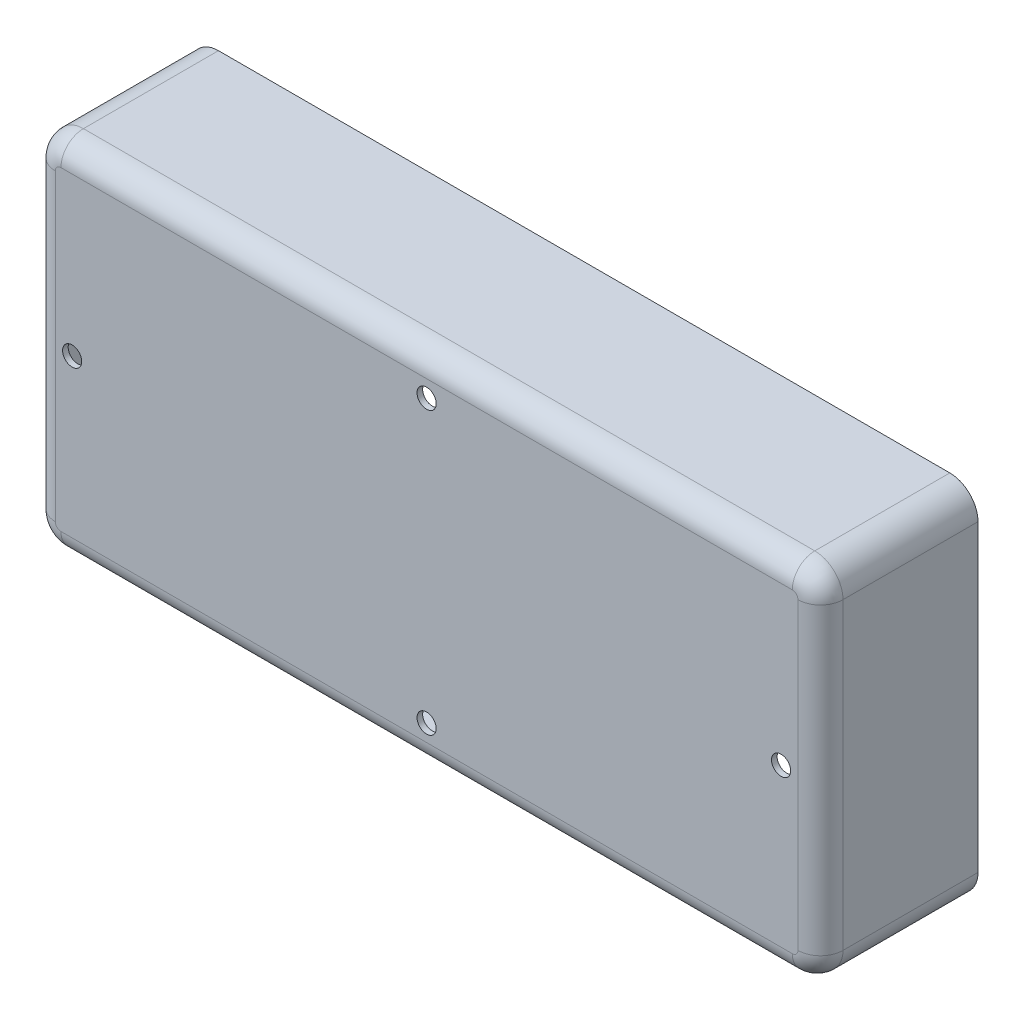
ISO-10303-21;
HEADER;
FILE_DESCRIPTION(('STEP AP214'),'2;1');
FILE_NAME('part.step','',(''),(''),'','','');
FILE_SCHEMA(('AUTOMOTIVE_DESIGN { 1 0 10303 214 1 1 1 1 }'));
ENDSEC;
DATA;
#1=APPLICATION_CONTEXT('core data for automotive mechanical design processes');
#2=APPLICATION_PROTOCOL_DEFINITION('international standard','automotive_design',2000,#1);
#3=PRODUCT_CONTEXT('',#1,'mechanical');
#4=PRODUCT('Part','Part','',(#3));
#5=PRODUCT_RELATED_PRODUCT_CATEGORY('part','',(#4));
#6=PRODUCT_DEFINITION_FORMATION('','',#4);
#7=PRODUCT_DEFINITION_CONTEXT('part definition',#1,'design');
#8=PRODUCT_DEFINITION('design','',#6,#7);
#9=PRODUCT_DEFINITION_SHAPE('','',#8);
#10=(LENGTH_UNIT() NAMED_UNIT(*) SI_UNIT(.MILLI.,.METRE.));
#11=(NAMED_UNIT(*) PLANE_ANGLE_UNIT() SI_UNIT($,.RADIAN.));
#12=(NAMED_UNIT(*) SI_UNIT($,.STERADIAN.) SOLID_ANGLE_UNIT());
#13=UNCERTAINTY_MEASURE_WITH_UNIT(LENGTH_MEASURE(1.E-05),#10,'distance_accuracy_value','');
#14=(GEOMETRIC_REPRESENTATION_CONTEXT(3) GLOBAL_UNCERTAINTY_ASSIGNED_CONTEXT((#13)) GLOBAL_UNIT_ASSIGNED_CONTEXT((#10,
#11,#12)) REPRESENTATION_CONTEXT('',''));
#15=CARTESIAN_POINT('',(0.,0.,0.));
#16=DIRECTION('',(0.,0.,1.));
#17=DIRECTION('',(1.,0.,0.));
#18=AXIS2_PLACEMENT_3D('',#15,#16,#17);
#19=CARTESIAN_POINT('',(-103.1748,-42.8498,44.45));
#20=DIRECTION('',(0.,0.,-1.));
#21=DIRECTION('',(-1.,0.,0.));
#22=AXIS2_PLACEMENT_3D('',#19,#20,#21);
#23=CYLINDRICAL_SURFACE('',#22,7.95019999999999);
#24=DIRECTION('',(0.,0.,-1.));
#25=VECTOR('',#24,1.);
#26=CARTESIAN_POINT('',(-103.1748,-50.8,44.45));
#27=LINE('',#26,#25);
#28=CARTESIAN_POINT('',(-103.1748,-50.8,38.1));
#29=VERTEX_POINT('',#28);
#30=CARTESIAN_POINT('',(-103.1748,-50.8,0.));
#31=VERTEX_POINT('',#30);
#32=EDGE_CURVE('E305',#29,#31,#27,.T.);
#33=ORIENTED_EDGE('',*,*,#32,.F.);
#34=CARTESIAN_POINT('',(-103.1748,-42.8498,38.1));
#35=DIRECTION('',(0.,0.,1.));
#36=DIRECTION('',(1.,0.,0.));
#37=AXIS2_PLACEMENT_3D('',#34,#35,#36);
#38=CIRCLE('',#37,7.95019999999999);
#39=CARTESIAN_POINT('',(-111.125,-42.8498,38.1));
#40=VERTEX_POINT('',#39);
#41=EDGE_CURVE('E12',#29,#40,#38,.F.);
#42=ORIENTED_EDGE('',*,*,#41,.T.);
#43=DIRECTION('',(0.,0.,-1.));
#44=VECTOR('',#43,1.);
#45=CARTESIAN_POINT('',(-111.125,-42.8498,44.45));
#46=LINE('',#45,#44);
#47=CARTESIAN_POINT('',(-111.125,-42.8498,0.));
#48=VERTEX_POINT('',#47);
#49=EDGE_CURVE('E291',#40,#48,#46,.T.);
#50=ORIENTED_EDGE('',*,*,#49,.T.);
#51=CARTESIAN_POINT('',(-103.1748,-42.8498,0.));
#52=DIRECTION('',(0.,0.,1.));
#53=DIRECTION('',(1.,0.,0.));
#54=AXIS2_PLACEMENT_3D('',#51,#52,#53);
#55=CIRCLE('',#54,7.95019999999999);
#56=EDGE_CURVE('E267',#48,#31,#55,.T.);
#57=ORIENTED_EDGE('',*,*,#56,.T.);
#58=EDGE_LOOP('',(#33,#42,#50,#57));
#59=FACE_BOUND('',#58,.T.);
#60=ADVANCED_FACE('F39',(#59),#23,.T.);
#61=CARTESIAN_POINT('',(-103.1748,-50.8,44.45));
#62=DIRECTION('',(0.,1.,0.));
#63=DIRECTION('',(0.,0.,1.));
#64=AXIS2_PLACEMENT_3D('',#61,#62,#63);
#65=PLANE('',#64);
#66=DIRECTION('',(0.,0.,-1.));
#67=VECTOR('',#66,1.);
#68=CARTESIAN_POINT('',(103.1748,-50.8,44.45));
#69=LINE('',#68,#67);
#70=CARTESIAN_POINT('',(103.1748,-50.8,38.1));
#71=VERTEX_POINT('',#70);
#72=CARTESIAN_POINT('',(103.1748,-50.8,0.));
#73=VERTEX_POINT('',#72);
#74=EDGE_CURVE('E303',#71,#73,#69,.T.);
#75=ORIENTED_EDGE('',*,*,#74,.F.);
#76=DIRECTION('',(1.,0.,0.));
#77=VECTOR('',#76,1.);
#78=CARTESIAN_POINT('',(-103.1748,-50.8,38.1));
#79=LINE('',#78,#77);
#80=EDGE_CURVE('E48',#71,#29,#79,.F.);
#81=ORIENTED_EDGE('',*,*,#80,.T.);
#82=ORIENTED_EDGE('',*,*,#32,.T.);
#83=DIRECTION('',(1.,0.,0.));
#84=VECTOR('',#83,1.);
#85=CARTESIAN_POINT('',(-103.1748,-50.8,0.));
#86=LINE('',#85,#84);
#87=EDGE_CURVE('E270',#31,#73,#86,.T.);
#88=ORIENTED_EDGE('',*,*,#87,.T.);
#89=EDGE_LOOP('',(#75,#81,#82,#88));
#90=FACE_BOUND('',#89,.T.);
#91=ADVANCED_FACE('F433',(#90),#65,.F.);
#92=CARTESIAN_POINT('',(103.1748,-42.8498,44.45));
#93=DIRECTION('',(0.,0.,-1.));
#94=DIRECTION('',(-1.,0.,0.));
#95=AXIS2_PLACEMENT_3D('',#92,#93,#94);
#96=CYLINDRICAL_SURFACE('',#95,7.95019999999999);
#97=DIRECTION('',(0.,0.,-1.));
#98=VECTOR('',#97,1.);
#99=CARTESIAN_POINT('',(111.125,-42.8498,44.45));
#100=LINE('',#99,#98);
#101=CARTESIAN_POINT('',(111.125,-42.8498,38.1));
#102=VERTEX_POINT('',#101);
#103=CARTESIAN_POINT('',(111.125,-42.8498,0.));
#104=VERTEX_POINT('',#103);
#105=EDGE_CURVE('E301',#102,#104,#100,.T.);
#106=ORIENTED_EDGE('',*,*,#105,.F.);
#107=CARTESIAN_POINT('',(103.1748,-42.8498,38.1));
#108=DIRECTION('',(0.,0.,1.));
#109=DIRECTION('',(1.,0.,0.));
#110=AXIS2_PLACEMENT_3D('',#107,#108,#109);
#111=CIRCLE('',#110,7.95019999999999);
#112=EDGE_CURVE('E335',#102,#71,#111,.F.);
#113=ORIENTED_EDGE('',*,*,#112,.T.);
#114=ORIENTED_EDGE('',*,*,#74,.T.);
#115=CARTESIAN_POINT('',(103.1748,-42.8498,0.));
#116=DIRECTION('',(0.,0.,1.));
#117=DIRECTION('',(1.,0.,0.));
#118=AXIS2_PLACEMENT_3D('',#115,#116,#117);
#119=CIRCLE('',#118,7.95019999999999);
#120=EDGE_CURVE('E273',#73,#104,#119,.T.);
#121=ORIENTED_EDGE('',*,*,#120,.T.);
#122=EDGE_LOOP('',(#106,#113,#114,#121));
#123=FACE_BOUND('',#122,.T.);
#124=ADVANCED_FACE('F373',(#123),#96,.T.);
#125=CARTESIAN_POINT('',(111.125,42.8498,44.45));
#126=DIRECTION('',(-1.,0.,0.));
#127=DIRECTION('',(0.,0.,1.));
#128=AXIS2_PLACEMENT_3D('',#125,#126,#127);
#129=PLANE('',#128);
#130=DIRECTION('',(0.,0.,-1.));
#131=VECTOR('',#130,1.);
#132=CARTESIAN_POINT('',(111.125,42.8498,44.45));
#133=LINE('',#132,#131);
#134=CARTESIAN_POINT('',(111.125,42.8498,38.1));
#135=VERTEX_POINT('',#134);
#136=CARTESIAN_POINT('',(111.125,42.8498,0.));
#137=VERTEX_POINT('',#136);
#138=EDGE_CURVE('E299',#135,#137,#133,.T.);
#139=ORIENTED_EDGE('',*,*,#138,.F.);
#140=DIRECTION('',(0.,1.,0.));
#141=VECTOR('',#140,1.);
#142=CARTESIAN_POINT('',(111.125,-42.8498,38.1));
#143=LINE('',#142,#141);
#144=EDGE_CURVE('E333',#135,#102,#143,.F.);
#145=ORIENTED_EDGE('',*,*,#144,.T.);
#146=ORIENTED_EDGE('',*,*,#105,.T.);
#147=DIRECTION('',(0.,1.,0.));
#148=VECTOR('',#147,1.);
#149=CARTESIAN_POINT('',(111.125,42.8498,0.));
#150=LINE('',#149,#148);
#151=EDGE_CURVE('E276',#104,#137,#150,.T.);
#152=ORIENTED_EDGE('',*,*,#151,.T.);
#153=EDGE_LOOP('',(#139,#145,#146,#152));
#154=FACE_BOUND('',#153,.T.);
#155=ADVANCED_FACE('F371',(#154),#129,.F.);
#156=CARTESIAN_POINT('',(103.1748,42.8498,44.45));
#157=DIRECTION('',(0.,0.,-1.));
#158=DIRECTION('',(-1.,0.,0.));
#159=AXIS2_PLACEMENT_3D('',#156,#157,#158);
#160=CYLINDRICAL_SURFACE('',#159,7.95019999999999);
#161=DIRECTION('',(0.,0.,-1.));
#162=VECTOR('',#161,1.);
#163=CARTESIAN_POINT('',(103.1748,50.8,44.45));
#164=LINE('',#163,#162);
#165=CARTESIAN_POINT('',(103.1748,50.8,38.1));
#166=VERTEX_POINT('',#165);
#167=CARTESIAN_POINT('',(103.1748,50.8,0.));
#168=VERTEX_POINT('',#167);
#169=EDGE_CURVE('E297',#166,#168,#164,.T.);
#170=ORIENTED_EDGE('',*,*,#169,.F.);
#171=CARTESIAN_POINT('',(103.1748,42.8498,38.1));
#172=DIRECTION('',(0.,0.,1.));
#173=DIRECTION('',(1.,0.,0.));
#174=AXIS2_PLACEMENT_3D('',#171,#172,#173);
#175=CIRCLE('',#174,7.95019999999999);
#176=EDGE_CURVE('E331',#166,#135,#175,.F.);
#177=ORIENTED_EDGE('',*,*,#176,.T.);
#178=ORIENTED_EDGE('',*,*,#138,.T.);
#179=CARTESIAN_POINT('',(103.1748,42.8498,0.));
#180=DIRECTION('',(0.,0.,1.));
#181=DIRECTION('',(-1.,0.,0.));
#182=AXIS2_PLACEMENT_3D('',#179,#180,#181);
#183=CIRCLE('',#182,7.95019999999999);
#184=EDGE_CURVE('E279',#137,#168,#183,.T.);
#185=ORIENTED_EDGE('',*,*,#184,.T.);
#186=EDGE_LOOP('',(#170,#177,#178,#185));
#187=FACE_BOUND('',#186,.T.);
#188=ADVANCED_FACE('F385',(#187),#160,.T.);
#189=CARTESIAN_POINT('',(-103.1748,50.8,44.45));
#190=DIRECTION('',(0.,-1.,0.));
#191=DIRECTION('',(0.,0.,-1.));
#192=AXIS2_PLACEMENT_3D('',#189,#190,#191);
#193=PLANE('',#192);
#194=DIRECTION('',(0.,0.,-1.));
#195=VECTOR('',#194,1.);
#196=CARTESIAN_POINT('',(-103.1748,50.8,44.45));
#197=LINE('',#196,#195);
#198=CARTESIAN_POINT('',(-103.1748,50.8,38.1));
#199=VERTEX_POINT('',#198);
#200=CARTESIAN_POINT('',(-103.1748,50.8,0.));
#201=VERTEX_POINT('',#200);
#202=EDGE_CURVE('E295',#199,#201,#197,.T.);
#203=ORIENTED_EDGE('',*,*,#202,.F.);
#204=DIRECTION('',(-1.,0.,0.));
#205=VECTOR('',#204,1.);
#206=CARTESIAN_POINT('',(103.1748,50.8,38.1));
#207=LINE('',#206,#205);
#208=EDGE_CURVE('E329',#199,#166,#207,.F.);
#209=ORIENTED_EDGE('',*,*,#208,.T.);
#210=ORIENTED_EDGE('',*,*,#169,.T.);
#211=DIRECTION('',(-1.,0.,0.));
#212=VECTOR('',#211,1.);
#213=CARTESIAN_POINT('',(-103.1748,50.8,0.));
#214=LINE('',#213,#212);
#215=EDGE_CURVE('E282',#168,#201,#214,.T.);
#216=ORIENTED_EDGE('',*,*,#215,.T.);
#217=EDGE_LOOP('',(#203,#209,#210,#216));
#218=FACE_BOUND('',#217,.T.);
#219=ADVANCED_FACE('F388',(#218),#193,.F.);
#220=CARTESIAN_POINT('',(-103.1748,42.8498,44.45));
#221=DIRECTION('',(0.,0.,-1.));
#222=DIRECTION('',(-1.,0.,0.));
#223=AXIS2_PLACEMENT_3D('',#220,#221,#222);
#224=CYLINDRICAL_SURFACE('',#223,7.95019999999999);
#225=DIRECTION('',(0.,0.,-1.));
#226=VECTOR('',#225,1.);
#227=CARTESIAN_POINT('',(-111.125,42.8498,44.45));
#228=LINE('',#227,#226);
#229=CARTESIAN_POINT('',(-111.125,42.8498,38.1));
#230=VERTEX_POINT('',#229);
#231=CARTESIAN_POINT('',(-111.125,42.8498,0.));
#232=VERTEX_POINT('',#231);
#233=EDGE_CURVE('E293',#230,#232,#228,.T.);
#234=ORIENTED_EDGE('',*,*,#233,.F.);
#235=CARTESIAN_POINT('',(-103.1748,42.8498,38.1));
#236=DIRECTION('',(0.,0.,1.));
#237=DIRECTION('',(1.,0.,0.));
#238=AXIS2_PLACEMENT_3D('',#235,#236,#237);
#239=CIRCLE('',#238,7.95019999999999);
#240=EDGE_CURVE('E327',#230,#199,#239,.F.);
#241=ORIENTED_EDGE('',*,*,#240,.T.);
#242=ORIENTED_EDGE('',*,*,#202,.T.);
#243=CARTESIAN_POINT('',(-103.1748,42.8498,0.));
#244=DIRECTION('',(0.,0.,1.));
#245=DIRECTION('',(1.,0.,0.));
#246=AXIS2_PLACEMENT_3D('',#243,#244,#245);
#247=CIRCLE('',#246,7.95019999999999);
#248=EDGE_CURVE('E285',#201,#232,#247,.T.);
#249=ORIENTED_EDGE('',*,*,#248,.T.);
#250=EDGE_LOOP('',(#234,#241,#242,#249));
#251=FACE_BOUND('',#250,.T.);
#252=ADVANCED_FACE('F447',(#251),#224,.T.);
#253=CARTESIAN_POINT('',(-111.125,42.8498,44.45));
#254=DIRECTION('',(1.,0.,0.));
#255=DIRECTION('',(0.,0.,-1.));
#256=AXIS2_PLACEMENT_3D('',#253,#254,#255);
#257=PLANE('',#256);
#258=ORIENTED_EDGE('',*,*,#49,.F.);
#259=DIRECTION('',(0.,-1.,0.));
#260=VECTOR('',#259,1.);
#261=CARTESIAN_POINT('',(-111.125,42.8498,38.1));
#262=LINE('',#261,#260);
#263=EDGE_CURVE('E324',#40,#230,#262,.F.);
#264=ORIENTED_EDGE('',*,*,#263,.T.);
#265=ORIENTED_EDGE('',*,*,#233,.T.);
#266=DIRECTION('',(0.,-1.,0.));
#267=VECTOR('',#266,1.);
#268=CARTESIAN_POINT('',(-111.125,42.8498,0.));
#269=LINE('',#268,#267);
#270=EDGE_CURVE('E288',#232,#48,#269,.T.);
#271=ORIENTED_EDGE('',*,*,#270,.T.);
#272=EDGE_LOOP('',(#258,#264,#265,#271));
#273=FACE_BOUND('',#272,.T.);
#274=ADVANCED_FACE('F417',(#273),#257,.F.);
#275=CARTESIAN_POINT('',(-103.1748,-42.8498,44.45));
#276=DIRECTION('',(0.,0.,1.));
#277=DIRECTION('',(1.,0.,0.));
#278=AXIS2_PLACEMENT_3D('',#275,#276,#277);
#279=PLANE('',#278);
#280=CARTESIAN_POINT('',(-100.0125,0.,44.45));
#281=DIRECTION('',(0.,0.,1.));
#282=DIRECTION('',(1.,0.,0.));
#283=AXIS2_PLACEMENT_3D('',#280,#281,#282);
#284=CIRCLE('',#283,2.7051);
#285=CARTESIAN_POINT('',(-97.3074,0.,44.45));
#286=VERTEX_POINT('',#285);
#287=EDGE_CURVE('E535',#286,#286,#284,.T.);
#288=ORIENTED_EDGE('',*,*,#287,.F.);
#289=EDGE_LOOP('',(#288));
#290=FACE_BOUND('',#289,.T.);
#291=CARTESIAN_POINT('',(100.0125,0.,44.45));
#292=DIRECTION('',(0.,0.,1.));
#293=DIRECTION('',(1.,0.,0.));
#294=AXIS2_PLACEMENT_3D('',#291,#292,#293);
#295=CIRCLE('',#294,2.7051);
#296=CARTESIAN_POINT('',(102.7176,0.,44.45));
#297=VERTEX_POINT('',#296);
#298=EDGE_CURVE('E539',#297,#297,#295,.T.);
#299=ORIENTED_EDGE('',*,*,#298,.F.);
#300=EDGE_LOOP('',(#299));
#301=FACE_BOUND('',#300,.T.);
#302=CARTESIAN_POINT('',(0.,-39.6875,44.45));
#303=DIRECTION('',(0.,0.,1.));
#304=DIRECTION('',(1.,0.,0.));
#305=AXIS2_PLACEMENT_3D('',#302,#303,#304);
#306=CIRCLE('',#305,2.7051);
#307=CARTESIAN_POINT('',(2.7051,-39.6875,44.45));
#308=VERTEX_POINT('',#307);
#309=EDGE_CURVE('E551',#308,#308,#306,.T.);
#310=ORIENTED_EDGE('',*,*,#309,.F.);
#311=EDGE_LOOP('',(#310));
#312=FACE_BOUND('',#311,.T.);
#313=CARTESIAN_POINT('',(0.,39.6875,44.45));
#314=DIRECTION('',(0.,0.,1.));
#315=DIRECTION('',(1.,0.,0.));
#316=AXIS2_PLACEMENT_3D('',#313,#314,#315);
#317=CIRCLE('',#316,2.7051);
#318=CARTESIAN_POINT('',(2.7051,39.6875,44.45));
#319=VERTEX_POINT('',#318);
#320=EDGE_CURVE('E243',#319,#319,#317,.T.);
#321=ORIENTED_EDGE('',*,*,#320,.F.);
#322=EDGE_LOOP('',(#321));
#323=FACE_BOUND('',#322,.T.);
#324=CARTESIAN_POINT('',(-103.1748,42.8498,44.45));
#325=DIRECTION('',(0.,0.,1.));
#326=DIRECTION('',(1.,0.,0.));
#327=AXIS2_PLACEMENT_3D('',#324,#325,#326);
#328=CIRCLE('',#327,1.60019999999999);
#329=CARTESIAN_POINT('',(-103.1748,44.45,44.45));
#330=VERTEX_POINT('',#329);
#331=CARTESIAN_POINT('',(-104.775,42.8498,44.45));
#332=VERTEX_POINT('',#331);
#333=EDGE_CURVE('E319',#330,#332,#328,.T.);
#334=ORIENTED_EDGE('',*,*,#333,.T.);
#335=DIRECTION('',(0.,-1.,0.));
#336=VECTOR('',#335,1.);
#337=CARTESIAN_POINT('',(-104.775,-42.8498,44.45));
#338=LINE('',#337,#336);
#339=CARTESIAN_POINT('',(-104.775,-42.8498,44.45));
#340=VERTEX_POINT('',#339);
#341=EDGE_CURVE('E321',#332,#340,#338,.T.);
#342=ORIENTED_EDGE('',*,*,#341,.T.);
#343=CARTESIAN_POINT('',(-103.1748,-42.8498,44.45));
#344=DIRECTION('',(0.,0.,1.));
#345=DIRECTION('',(1.,0.,0.));
#346=AXIS2_PLACEMENT_3D('',#343,#344,#345);
#347=CIRCLE('',#346,1.60019999999999);
#348=CARTESIAN_POINT('',(-103.1748,-44.45,44.45));
#349=VERTEX_POINT('',#348);
#350=EDGE_CURVE('E307',#340,#349,#347,.T.);
#351=ORIENTED_EDGE('',*,*,#350,.T.);
#352=DIRECTION('',(1.,0.,0.));
#353=VECTOR('',#352,1.);
#354=CARTESIAN_POINT('',(103.1748,-44.45,44.45));
#355=LINE('',#354,#353);
#356=CARTESIAN_POINT('',(103.1748,-44.45,44.45));
#357=VERTEX_POINT('',#356);
#358=EDGE_CURVE('E309',#349,#357,#355,.T.);
#359=ORIENTED_EDGE('',*,*,#358,.T.);
#360=CARTESIAN_POINT('',(103.1748,-42.8498,44.45));
#361=DIRECTION('',(0.,0.,1.));
#362=DIRECTION('',(1.,0.,0.));
#363=AXIS2_PLACEMENT_3D('',#360,#361,#362);
#364=CIRCLE('',#363,1.60019999999999);
#365=CARTESIAN_POINT('',(104.775,-42.8498,44.45));
#366=VERTEX_POINT('',#365);
#367=EDGE_CURVE('E311',#357,#366,#364,.T.);
#368=ORIENTED_EDGE('',*,*,#367,.T.);
#369=DIRECTION('',(0.,1.,0.));
#370=VECTOR('',#369,1.);
#371=CARTESIAN_POINT('',(104.775,42.8498,44.45));
#372=LINE('',#371,#370);
#373=CARTESIAN_POINT('',(104.775,42.8498,44.45));
#374=VERTEX_POINT('',#373);
#375=EDGE_CURVE('E313',#366,#374,#372,.T.);
#376=ORIENTED_EDGE('',*,*,#375,.T.);
#377=CARTESIAN_POINT('',(103.1748,42.8498,44.45));
#378=DIRECTION('',(0.,0.,1.));
#379=DIRECTION('',(1.,0.,0.));
#380=AXIS2_PLACEMENT_3D('',#377,#378,#379);
#381=CIRCLE('',#380,1.60019999999999);
#382=CARTESIAN_POINT('',(103.1748,44.45,44.45));
#383=VERTEX_POINT('',#382);
#384=EDGE_CURVE('E315',#374,#383,#381,.T.);
#385=ORIENTED_EDGE('',*,*,#384,.T.);
#386=DIRECTION('',(-1.,0.,0.));
#387=VECTOR('',#386,1.);
#388=CARTESIAN_POINT('',(-103.1748,44.45,44.45));
#389=LINE('',#388,#387);
#390=EDGE_CURVE('E317',#383,#330,#389,.T.);
#391=ORIENTED_EDGE('',*,*,#390,.T.);
#392=EDGE_LOOP('',(#334,#342,#351,#359,#368,#376,#385,#391));
#393=FACE_BOUND('',#392,.T.);
#394=ADVANCED_FACE('F401',(#290,#301,#312,#323,#393),#279,.T.);
#395=CARTESIAN_POINT('',(-103.1748,-42.8498,0.));
#396=DIRECTION('',(0.,0.,1.));
#397=DIRECTION('',(1.,0.,0.));
#398=AXIS2_PLACEMENT_3D('',#395,#396,#397);
#399=PLANE('',#398);
#400=DIRECTION('',(0.,-1.,0.));
#401=VECTOR('',#400,1.);
#402=CARTESIAN_POINT('',(-109.5375,42.8498,0.));
#403=LINE('',#402,#401);
#404=CARTESIAN_POINT('',(-109.5375,42.8498,0.));
#405=VERTEX_POINT('',#404);
#406=CARTESIAN_POINT('',(-109.5375,-42.8498,0.));
#407=VERTEX_POINT('',#406);
#408=EDGE_CURVE('E224',#405,#407,#403,.T.);
#409=ORIENTED_EDGE('',*,*,#408,.T.);
#410=CARTESIAN_POINT('',(-103.1748,-42.8498,0.));
#411=DIRECTION('',(0.,0.,1.));
#412=DIRECTION('',(1.,0.,0.));
#413=AXIS2_PLACEMENT_3D('',#410,#411,#412);
#414=CIRCLE('',#413,6.36269999999999);
#415=CARTESIAN_POINT('',(-103.1748,-49.2125,0.));
#416=VERTEX_POINT('',#415);
#417=EDGE_CURVE('E219',#407,#416,#414,.T.);
#418=ORIENTED_EDGE('',*,*,#417,.T.);
#419=DIRECTION('',(1.,0.,0.));
#420=VECTOR('',#419,1.);
#421=CARTESIAN_POINT('',(-103.1748,-49.2125,0.));
#422=LINE('',#421,#420);
#423=CARTESIAN_POINT('',(103.1748,-49.2125,0.));
#424=VERTEX_POINT('',#423);
#425=EDGE_CURVE('E249',#416,#424,#422,.T.);
#426=ORIENTED_EDGE('',*,*,#425,.T.);
#427=CARTESIAN_POINT('',(103.1748,-42.8498,0.));
#428=DIRECTION('',(0.,0.,1.));
#429=DIRECTION('',(1.,0.,0.));
#430=AXIS2_PLACEMENT_3D('',#427,#428,#429);
#431=CIRCLE('',#430,6.36269999999999);
#432=CARTESIAN_POINT('',(109.5375,-42.8498,0.));
#433=VERTEX_POINT('',#432);
#434=EDGE_CURVE('E56',#424,#433,#431,.T.);
#435=ORIENTED_EDGE('',*,*,#434,.T.);
#436=DIRECTION('',(0.,1.,0.));
#437=VECTOR('',#436,1.);
#438=CARTESIAN_POINT('',(109.5375,42.8498,0.));
#439=LINE('',#438,#437);
#440=CARTESIAN_POINT('',(109.5375,42.8498,0.));
#441=VERTEX_POINT('',#440);
#442=EDGE_CURVE('E261',#433,#441,#439,.T.);
#443=ORIENTED_EDGE('',*,*,#442,.T.);
#444=CARTESIAN_POINT('',(103.1748,42.8498,0.));
#445=DIRECTION('',(0.,0.,1.));
#446=DIRECTION('',(1.,0.,0.));
#447=AXIS2_PLACEMENT_3D('',#444,#445,#446);
#448=CIRCLE('',#447,6.36269999999999);
#449=CARTESIAN_POINT('',(103.1748,49.2125,0.));
#450=VERTEX_POINT('',#449);
#451=EDGE_CURVE('E258',#441,#450,#448,.T.);
#452=ORIENTED_EDGE('',*,*,#451,.T.);
#453=DIRECTION('',(-1.,0.,0.));
#454=VECTOR('',#453,1.);
#455=CARTESIAN_POINT('',(-103.1748,49.2125,0.));
#456=LINE('',#455,#454);
#457=CARTESIAN_POINT('',(-103.1748,49.2125,0.));
#458=VERTEX_POINT('',#457);
#459=EDGE_CURVE('E255',#450,#458,#456,.T.);
#460=ORIENTED_EDGE('',*,*,#459,.T.);
#461=CARTESIAN_POINT('',(-103.1748,42.8498,0.));
#462=DIRECTION('',(0.,0.,1.));
#463=DIRECTION('',(1.,0.,0.));
#464=AXIS2_PLACEMENT_3D('',#461,#462,#463);
#465=CIRCLE('',#464,6.36269999999999);
#466=EDGE_CURVE('E252',#458,#405,#465,.T.);
#467=ORIENTED_EDGE('',*,*,#466,.T.);
#468=EDGE_LOOP('',(#409,#418,#426,#435,#443,#452,#460,#467));
#469=FACE_BOUND('',#468,.T.);
#470=ORIENTED_EDGE('',*,*,#56,.F.);
#471=ORIENTED_EDGE('',*,*,#270,.F.);
#472=ORIENTED_EDGE('',*,*,#248,.F.);
#473=ORIENTED_EDGE('',*,*,#215,.F.);
#474=ORIENTED_EDGE('',*,*,#184,.F.);
#475=ORIENTED_EDGE('',*,*,#151,.F.);
#476=ORIENTED_EDGE('',*,*,#120,.F.);
#477=ORIENTED_EDGE('',*,*,#87,.F.);
#478=EDGE_LOOP('',(#470,#471,#472,#473,#474,#475,#476,#477));
#479=FACE_BOUND('',#478,.T.);
#480=ADVANCED_FACE('F380',(#469,#479),#399,.F.);
#481=CARTESIAN_POINT('',(104.775,-42.8498,38.1));
#482=DIRECTION('',(0.,-1.,0.));
#483=DIRECTION('',(0.,0.,-1.));
#484=AXIS2_PLACEMENT_3D('',#481,#482,#483);
#485=CYLINDRICAL_SURFACE('',#484,6.35);
#486=CARTESIAN_POINT('',(104.775,-42.8498,38.1));
#487=DIRECTION('',(0.,-1.,0.));
#488=DIRECTION('',(0.,0.,-1.));
#489=AXIS2_PLACEMENT_3D('',#486,#487,#488);
#490=CIRCLE('',#489,6.35);
#491=EDGE_CURVE('E352',#102,#366,#490,.T.);
#492=ORIENTED_EDGE('',*,*,#491,.F.);
#493=ORIENTED_EDGE('',*,*,#144,.F.);
#494=CARTESIAN_POINT('',(104.775,42.8498,38.1));
#495=DIRECTION('',(0.,1.,0.));
#496=DIRECTION('',(0.,0.,1.));
#497=AXIS2_PLACEMENT_3D('',#494,#495,#496);
#498=CIRCLE('',#497,6.35);
#499=EDGE_CURVE('E43',#374,#135,#498,.T.);
#500=ORIENTED_EDGE('',*,*,#499,.F.);
#501=ORIENTED_EDGE('',*,*,#375,.F.);
#502=EDGE_LOOP('',(#492,#493,#500,#501));
#503=FACE_BOUND('',#502,.T.);
#504=ADVANCED_FACE('F41',(#503),#485,.T.);
#505=CARTESIAN_POINT('',(103.1748,42.8498,38.1));
#506=DIRECTION('',(0.,0.,1.));
#507=DIRECTION('',(1.,0.,0.));
#508=AXIS2_PLACEMENT_3D('',#505,#506,#507);
#509=DEGENERATE_TOROIDAL_SURFACE('',#508,1.60019999999999,6.35,.T.);
#510=ORIENTED_EDGE('',*,*,#499,.T.);
#511=ORIENTED_EDGE('',*,*,#176,.F.);
#512=CARTESIAN_POINT('',(103.1748,44.45,38.1));
#513=DIRECTION('',(-1.,0.,0.));
#514=DIRECTION('',(0.,0.,1.));
#515=AXIS2_PLACEMENT_3D('',#512,#513,#514);
#516=CIRCLE('',#515,6.35);
#517=EDGE_CURVE('E350',#383,#166,#516,.T.);
#518=ORIENTED_EDGE('',*,*,#517,.F.);
#519=ORIENTED_EDGE('',*,*,#384,.F.);
#520=EDGE_LOOP('',(#510,#511,#518,#519));
#521=FACE_BOUND('',#520,.T.);
#522=ADVANCED_FACE('F363',(#521),#509,.T.);
#523=CARTESIAN_POINT('',(103.1748,-42.8498,38.1));
#524=DIRECTION('',(0.,0.,1.));
#525=DIRECTION('',(1.,0.,0.));
#526=AXIS2_PLACEMENT_3D('',#523,#524,#525);
#527=DEGENERATE_TOROIDAL_SURFACE('',#526,1.60019999999999,6.35,.T.);
#528=ORIENTED_EDGE('',*,*,#491,.T.);
#529=ORIENTED_EDGE('',*,*,#367,.F.);
#530=CARTESIAN_POINT('',(103.1748,-44.45,38.1));
#531=DIRECTION('',(-1.,0.,0.));
#532=DIRECTION('',(0.,0.,1.));
#533=AXIS2_PLACEMENT_3D('',#530,#531,#532);
#534=CIRCLE('',#533,6.35);
#535=EDGE_CURVE('E347',#71,#357,#534,.T.);
#536=ORIENTED_EDGE('',*,*,#535,.F.);
#537=ORIENTED_EDGE('',*,*,#112,.F.);
#538=EDGE_LOOP('',(#528,#529,#536,#537));
#539=FACE_BOUND('',#538,.T.);
#540=ADVANCED_FACE('F404',(#539),#527,.T.);
#541=CARTESIAN_POINT('',(-103.1748,44.45,38.1));
#542=DIRECTION('',(1.,0.,0.));
#543=DIRECTION('',(0.,0.,-1.));
#544=AXIS2_PLACEMENT_3D('',#541,#542,#543);
#545=CYLINDRICAL_SURFACE('',#544,6.35);
#546=ORIENTED_EDGE('',*,*,#517,.T.);
#547=ORIENTED_EDGE('',*,*,#208,.F.);
#548=CARTESIAN_POINT('',(-103.1748,44.45,38.1));
#549=DIRECTION('',(-1.,0.,0.));
#550=DIRECTION('',(0.,0.,1.));
#551=AXIS2_PLACEMENT_3D('',#548,#549,#550);
#552=CIRCLE('',#551,6.35);
#553=EDGE_CURVE('E344',#330,#199,#552,.T.);
#554=ORIENTED_EDGE('',*,*,#553,.F.);
#555=ORIENTED_EDGE('',*,*,#390,.F.);
#556=EDGE_LOOP('',(#546,#547,#554,#555));
#557=FACE_BOUND('',#556,.T.);
#558=ADVANCED_FACE('F392',(#557),#545,.T.);
#559=CARTESIAN_POINT('',(-103.1748,-44.45,38.1));
#560=DIRECTION('',(-1.,0.,0.));
#561=DIRECTION('',(0.,0.,1.));
#562=AXIS2_PLACEMENT_3D('',#559,#560,#561);
#563=CYLINDRICAL_SURFACE('',#562,6.35);
#564=ORIENTED_EDGE('',*,*,#535,.T.);
#565=ORIENTED_EDGE('',*,*,#358,.F.);
#566=CARTESIAN_POINT('',(-103.1748,-44.45,38.1));
#567=DIRECTION('',(-1.,0.,0.));
#568=DIRECTION('',(0.,0.,1.));
#569=AXIS2_PLACEMENT_3D('',#566,#567,#568);
#570=CIRCLE('',#569,6.35);
#571=EDGE_CURVE('E341',#29,#349,#570,.T.);
#572=ORIENTED_EDGE('',*,*,#571,.F.);
#573=ORIENTED_EDGE('',*,*,#80,.F.);
#574=EDGE_LOOP('',(#564,#565,#572,#573));
#575=FACE_BOUND('',#574,.T.);
#576=ADVANCED_FACE('F406',(#575),#563,.T.);
#577=CARTESIAN_POINT('',(-103.1748,42.8498,38.1));
#578=DIRECTION('',(0.,0.,1.));
#579=DIRECTION('',(1.,0.,0.));
#580=AXIS2_PLACEMENT_3D('',#577,#578,#579);
#581=DEGENERATE_TOROIDAL_SURFACE('',#580,1.60019999999999,6.35,.T.);
#582=ORIENTED_EDGE('',*,*,#553,.T.);
#583=ORIENTED_EDGE('',*,*,#240,.F.);
#584=CARTESIAN_POINT('',(-104.775,42.8498,38.1));
#585=DIRECTION('',(0.,-1.,0.));
#586=DIRECTION('',(0.,0.,-1.));
#587=AXIS2_PLACEMENT_3D('',#584,#585,#586);
#588=CIRCLE('',#587,6.35);
#589=EDGE_CURVE('E339',#332,#230,#588,.T.);
#590=ORIENTED_EDGE('',*,*,#589,.F.);
#591=ORIENTED_EDGE('',*,*,#333,.F.);
#592=EDGE_LOOP('',(#582,#583,#590,#591));
#593=FACE_BOUND('',#592,.T.);
#594=ADVANCED_FACE('F397',(#593),#581,.T.);
#595=CARTESIAN_POINT('',(-103.1748,-42.8498,38.1));
#596=DIRECTION('',(0.,0.,1.));
#597=DIRECTION('',(1.,0.,0.));
#598=AXIS2_PLACEMENT_3D('',#595,#596,#597);
#599=DEGENERATE_TOROIDAL_SURFACE('',#598,1.60019999999999,6.35,.T.);
#600=ORIENTED_EDGE('',*,*,#571,.T.);
#601=ORIENTED_EDGE('',*,*,#350,.F.);
#602=CARTESIAN_POINT('',(-104.775,-42.8498,38.1));
#603=DIRECTION('',(0.,1.,0.));
#604=DIRECTION('',(0.,0.,1.));
#605=AXIS2_PLACEMENT_3D('',#602,#603,#604);
#606=CIRCLE('',#605,6.35);
#607=EDGE_CURVE('E211',#40,#340,#606,.T.);
#608=ORIENTED_EDGE('',*,*,#607,.F.);
#609=ORIENTED_EDGE('',*,*,#41,.F.);
#610=EDGE_LOOP('',(#600,#601,#608,#609));
#611=FACE_BOUND('',#610,.T.);
#612=ADVANCED_FACE('F412',(#611),#599,.T.);
#613=CARTESIAN_POINT('',(-104.775,-42.8498,38.1));
#614=DIRECTION('',(0.,1.,0.));
#615=DIRECTION('',(0.,0.,1.));
#616=AXIS2_PLACEMENT_3D('',#613,#614,#615);
#617=CYLINDRICAL_SURFACE('',#616,6.35);
#618=ORIENTED_EDGE('',*,*,#589,.T.);
#619=ORIENTED_EDGE('',*,*,#263,.F.);
#620=ORIENTED_EDGE('',*,*,#607,.T.);
#621=ORIENTED_EDGE('',*,*,#341,.F.);
#622=EDGE_LOOP('',(#618,#619,#620,#621));
#623=FACE_BOUND('',#622,.T.);
#624=ADVANCED_FACE('F421',(#623),#617,.T.);
#625=CARTESIAN_POINT('',(-103.1748,-42.8498,44.45));
#626=DIRECTION('',(0.,0.,-1.));
#627=DIRECTION('',(-1.,0.,0.));
#628=AXIS2_PLACEMENT_3D('',#625,#626,#627);
#629=CYLINDRICAL_SURFACE('',#628,6.36269999999999);
#630=DIRECTION('',(0.,0.,1.));
#631=VECTOR('',#630,1.);
#632=CARTESIAN_POINT('',(-103.1748,-49.2125,44.45));
#633=LINE('',#632,#631);
#634=CARTESIAN_POINT('',(-103.1748,-49.2125,38.1));
#635=VERTEX_POINT('',#634);
#636=EDGE_CURVE('E564',#635,#416,#633,.F.);
#637=ORIENTED_EDGE('',*,*,#636,.T.);
#638=ORIENTED_EDGE('',*,*,#417,.F.);
#639=DIRECTION('',(0.,0.,-1.));
#640=VECTOR('',#639,1.);
#641=CARTESIAN_POINT('',(-109.5375,-42.8498,44.45));
#642=LINE('',#641,#640);
#643=CARTESIAN_POINT('',(-109.5375,-42.8498,38.1));
#644=VERTEX_POINT('',#643);
#645=EDGE_CURVE('E215',#644,#407,#642,.T.);
#646=ORIENTED_EDGE('',*,*,#645,.F.);
#647=CARTESIAN_POINT('',(-103.1748,-42.8498,38.1));
#648=DIRECTION('',(0.,0.,-1.));
#649=DIRECTION('',(-1.,0.,0.));
#650=AXIS2_PLACEMENT_3D('',#647,#648,#649);
#651=CIRCLE('',#650,6.36269999999999);
#652=EDGE_CURVE('E202',#635,#644,#651,.T.);
#653=ORIENTED_EDGE('',*,*,#652,.F.);
#654=EDGE_LOOP('',(#637,#638,#646,#653));
#655=FACE_BOUND('',#654,.T.);
#656=ADVANCED_FACE('F217',(#655),#629,.F.);
#657=CARTESIAN_POINT('',(-103.1748,-49.2125,44.45));
#658=DIRECTION('',(0.,1.,0.));
#659=DIRECTION('',(0.,0.,1.));
#660=AXIS2_PLACEMENT_3D('',#657,#658,#659);
#661=PLANE('',#660);
#662=DIRECTION('',(0.,0.,-1.));
#663=VECTOR('',#662,1.);
#664=CARTESIAN_POINT('',(103.1748,-49.2125,44.45));
#665=LINE('',#664,#663);
#666=CARTESIAN_POINT('',(103.1748,-49.2125,38.1));
#667=VERTEX_POINT('',#666);
#668=EDGE_CURVE('E566',#667,#424,#665,.T.);
#669=ORIENTED_EDGE('',*,*,#668,.T.);
#670=ORIENTED_EDGE('',*,*,#425,.F.);
#671=ORIENTED_EDGE('',*,*,#636,.F.);
#672=DIRECTION('',(1.,0.,0.));
#673=VECTOR('',#672,1.);
#674=CARTESIAN_POINT('',(-103.1748,-49.2125,38.1));
#675=LINE('',#674,#673);
#676=EDGE_CURVE('E212',#667,#635,#675,.F.);
#677=ORIENTED_EDGE('',*,*,#676,.F.);
#678=EDGE_LOOP('',(#669,#670,#671,#677));
#679=FACE_BOUND('',#678,.T.);
#680=ADVANCED_FACE('F428',(#679),#661,.T.);
#681=CARTESIAN_POINT('',(103.1748,-42.8498,44.45));
#682=DIRECTION('',(0.,0.,-1.));
#683=DIRECTION('',(-1.,0.,0.));
#684=AXIS2_PLACEMENT_3D('',#681,#682,#683);
#685=CYLINDRICAL_SURFACE('',#684,6.36269999999999);
#686=DIRECTION('',(0.,0.,1.));
#687=VECTOR('',#686,1.);
#688=CARTESIAN_POINT('',(109.5375,-42.8498,44.45));
#689=LINE('',#688,#687);
#690=CARTESIAN_POINT('',(109.5375,-42.8498,38.1));
#691=VERTEX_POINT('',#690);
#692=EDGE_CURVE('E569',#691,#433,#689,.F.);
#693=ORIENTED_EDGE('',*,*,#692,.T.);
#694=ORIENTED_EDGE('',*,*,#434,.F.);
#695=ORIENTED_EDGE('',*,*,#668,.F.);
#696=CARTESIAN_POINT('',(103.1748,-42.8498,38.1));
#697=DIRECTION('',(0.,0.,-1.));
#698=DIRECTION('',(-1.,0.,0.));
#699=AXIS2_PLACEMENT_3D('',#696,#697,#698);
#700=CIRCLE('',#699,6.36269999999999);
#701=EDGE_CURVE('E571',#691,#667,#700,.T.);
#702=ORIENTED_EDGE('',*,*,#701,.F.);
#703=EDGE_LOOP('',(#693,#694,#695,#702));
#704=FACE_BOUND('',#703,.T.);
#705=ADVANCED_FACE('F509',(#704),#685,.F.);
#706=CARTESIAN_POINT('',(109.5375,42.8498,44.45));
#707=DIRECTION('',(-1.,0.,0.));
#708=DIRECTION('',(0.,0.,1.));
#709=AXIS2_PLACEMENT_3D('',#706,#707,#708);
#710=PLANE('',#709);
#711=DIRECTION('',(0.,0.,-1.));
#712=VECTOR('',#711,1.);
#713=CARTESIAN_POINT('',(109.5375,42.8498,44.45));
#714=LINE('',#713,#712);
#715=CARTESIAN_POINT('',(109.5375,42.8498,38.1));
#716=VERTEX_POINT('',#715);
#717=EDGE_CURVE('E573',#716,#441,#714,.T.);
#718=ORIENTED_EDGE('',*,*,#717,.T.);
#719=ORIENTED_EDGE('',*,*,#442,.F.);
#720=ORIENTED_EDGE('',*,*,#692,.F.);
#721=DIRECTION('',(0.,1.,0.));
#722=VECTOR('',#721,1.);
#723=CARTESIAN_POINT('',(109.5375,42.8498,38.1));
#724=LINE('',#723,#722);
#725=EDGE_CURVE('E575',#716,#691,#724,.F.);
#726=ORIENTED_EDGE('',*,*,#725,.F.);
#727=EDGE_LOOP('',(#718,#719,#720,#726));
#728=FACE_BOUND('',#727,.T.);
#729=ADVANCED_FACE('F505',(#728),#710,.T.);
#730=CARTESIAN_POINT('',(103.1748,42.8498,44.45));
#731=DIRECTION('',(0.,0.,-1.));
#732=DIRECTION('',(-1.,0.,0.));
#733=AXIS2_PLACEMENT_3D('',#730,#731,#732);
#734=CYLINDRICAL_SURFACE('',#733,6.36269999999999);
#735=DIRECTION('',(0.,0.,-1.));
#736=VECTOR('',#735,1.);
#737=CARTESIAN_POINT('',(103.1748,49.2125,44.45));
#738=LINE('',#737,#736);
#739=CARTESIAN_POINT('',(103.1748,49.2125,38.1));
#740=VERTEX_POINT('',#739);
#741=EDGE_CURVE('E577',#740,#450,#738,.T.);
#742=ORIENTED_EDGE('',*,*,#741,.T.);
#743=ORIENTED_EDGE('',*,*,#451,.F.);
#744=ORIENTED_EDGE('',*,*,#717,.F.);
#745=CARTESIAN_POINT('',(103.1748,42.8498,38.1));
#746=DIRECTION('',(0.,0.,-1.));
#747=DIRECTION('',(-1.,0.,0.));
#748=AXIS2_PLACEMENT_3D('',#745,#746,#747);
#749=CIRCLE('',#748,6.36269999999999);
#750=EDGE_CURVE('E579',#740,#716,#749,.T.);
#751=ORIENTED_EDGE('',*,*,#750,.F.);
#752=EDGE_LOOP('',(#742,#743,#744,#751));
#753=FACE_BOUND('',#752,.T.);
#754=ADVANCED_FACE('F501',(#753),#734,.F.);
#755=CARTESIAN_POINT('',(-103.1748,49.2125,44.45));
#756=DIRECTION('',(0.,-1.,0.));
#757=DIRECTION('',(0.,0.,-1.));
#758=AXIS2_PLACEMENT_3D('',#755,#756,#757);
#759=PLANE('',#758);
#760=DIRECTION('',(0.,0.,-1.));
#761=VECTOR('',#760,1.);
#762=CARTESIAN_POINT('',(-103.1748,49.2125,44.45));
#763=LINE('',#762,#761);
#764=CARTESIAN_POINT('',(-103.1748,49.2125,38.1));
#765=VERTEX_POINT('',#764);
#766=EDGE_CURVE('E581',#765,#458,#763,.T.);
#767=ORIENTED_EDGE('',*,*,#766,.T.);
#768=ORIENTED_EDGE('',*,*,#459,.F.);
#769=ORIENTED_EDGE('',*,*,#741,.F.);
#770=DIRECTION('',(1.,0.,0.));
#771=VECTOR('',#770,1.);
#772=CARTESIAN_POINT('',(-103.1748,49.2125,38.1));
#773=LINE('',#772,#771);
#774=EDGE_CURVE('E583',#765,#740,#773,.T.);
#775=ORIENTED_EDGE('',*,*,#774,.F.);
#776=EDGE_LOOP('',(#767,#768,#769,#775));
#777=FACE_BOUND('',#776,.T.);
#778=ADVANCED_FACE('F497',(#777),#759,.T.);
#779=CARTESIAN_POINT('',(-103.1748,42.8498,44.45));
#780=DIRECTION('',(0.,0.,-1.));
#781=DIRECTION('',(-1.,0.,0.));
#782=AXIS2_PLACEMENT_3D('',#779,#780,#781);
#783=CYLINDRICAL_SURFACE('',#782,6.36269999999999);
#784=DIRECTION('',(0.,0.,-1.));
#785=VECTOR('',#784,1.);
#786=CARTESIAN_POINT('',(-109.5375,42.8498,44.45));
#787=LINE('',#786,#785);
#788=CARTESIAN_POINT('',(-109.5375,42.8498,38.1));
#789=VERTEX_POINT('',#788);
#790=EDGE_CURVE('E223',#789,#405,#787,.T.);
#791=ORIENTED_EDGE('',*,*,#790,.T.);
#792=ORIENTED_EDGE('',*,*,#466,.F.);
#793=ORIENTED_EDGE('',*,*,#766,.F.);
#794=CARTESIAN_POINT('',(-103.1748,42.8498,38.1));
#795=DIRECTION('',(0.,0.,-1.));
#796=DIRECTION('',(-1.,0.,0.));
#797=AXIS2_PLACEMENT_3D('',#794,#795,#796);
#798=CIRCLE('',#797,6.36269999999999);
#799=EDGE_CURVE('E232',#789,#765,#798,.T.);
#800=ORIENTED_EDGE('',*,*,#799,.F.);
#801=EDGE_LOOP('',(#791,#792,#793,#800));
#802=FACE_BOUND('',#801,.T.);
#803=ADVANCED_FACE('F494',(#802),#783,.F.);
#804=CARTESIAN_POINT('',(-109.5375,42.8498,44.45));
#805=DIRECTION('',(1.,0.,0.));
#806=DIRECTION('',(0.,0.,-1.));
#807=AXIS2_PLACEMENT_3D('',#804,#805,#806);
#808=PLANE('',#807);
#809=ORIENTED_EDGE('',*,*,#645,.T.);
#810=ORIENTED_EDGE('',*,*,#408,.F.);
#811=ORIENTED_EDGE('',*,*,#790,.F.);
#812=DIRECTION('',(0.,1.,0.));
#813=VECTOR('',#812,1.);
#814=CARTESIAN_POINT('',(-109.5375,42.8498,38.1));
#815=LINE('',#814,#813);
#816=EDGE_CURVE('E228',#644,#789,#815,.T.);
#817=ORIENTED_EDGE('',*,*,#816,.F.);
#818=EDGE_LOOP('',(#809,#810,#811,#817));
#819=FACE_BOUND('',#818,.T.);
#820=ADVANCED_FACE('F229',(#819),#808,.T.);
#821=CARTESIAN_POINT('',(-103.1748,-42.8498,42.8625));
#822=DIRECTION('',(0.,0.,1.));
#823=DIRECTION('',(1.,0.,0.));
#824=AXIS2_PLACEMENT_3D('',#821,#822,#823);
#825=PLANE('',#824);
#826=CARTESIAN_POINT('',(-100.0125,0.,42.8625));
#827=DIRECTION('',(0.,0.,1.));
#828=DIRECTION('',(1.,0.,0.));
#829=AXIS2_PLACEMENT_3D('',#826,#827,#828);
#830=CIRCLE('',#829,2.7051);
#831=CARTESIAN_POINT('',(-97.3074,0.,42.8625));
#832=VERTEX_POINT('',#831);
#833=EDGE_CURVE('E538',#832,#832,#830,.F.);
#834=ORIENTED_EDGE('',*,*,#833,.F.);
#835=EDGE_LOOP('',(#834));
#836=FACE_BOUND('',#835,.T.);
#837=CARTESIAN_POINT('',(100.0125,0.,42.8625));
#838=DIRECTION('',(0.,0.,1.));
#839=DIRECTION('',(1.,0.,0.));
#840=AXIS2_PLACEMENT_3D('',#837,#838,#839);
#841=CIRCLE('',#840,2.7051);
#842=CARTESIAN_POINT('',(102.7176,0.,42.8625));
#843=VERTEX_POINT('',#842);
#844=EDGE_CURVE('E543',#843,#843,#841,.F.);
#845=ORIENTED_EDGE('',*,*,#844,.F.);
#846=EDGE_LOOP('',(#845));
#847=FACE_BOUND('',#846,.T.);
#848=CARTESIAN_POINT('',(0.,-39.6875,42.8625));
#849=DIRECTION('',(0.,0.,1.));
#850=DIRECTION('',(1.,0.,0.));
#851=AXIS2_PLACEMENT_3D('',#848,#849,#850);
#852=CIRCLE('',#851,2.7051);
#853=CARTESIAN_POINT('',(2.7051,-39.6875,42.8625));
#854=VERTEX_POINT('',#853);
#855=EDGE_CURVE('E556',#854,#854,#852,.F.);
#856=ORIENTED_EDGE('',*,*,#855,.F.);
#857=EDGE_LOOP('',(#856));
#858=FACE_BOUND('',#857,.T.);
#859=CARTESIAN_POINT('',(0.,39.6875,42.8625));
#860=DIRECTION('',(0.,0.,1.));
#861=DIRECTION('',(1.,0.,0.));
#862=AXIS2_PLACEMENT_3D('',#859,#860,#861);
#863=CIRCLE('',#862,2.7051);
#864=CARTESIAN_POINT('',(2.7051,39.6875,42.8625));
#865=VERTEX_POINT('',#864);
#866=EDGE_CURVE('E239',#865,#865,#863,.F.);
#867=ORIENTED_EDGE('',*,*,#866,.F.);
#868=EDGE_LOOP('',(#867));
#869=FACE_BOUND('',#868,.T.);
#870=CARTESIAN_POINT('',(-103.1748,42.8498,42.8625));
#871=DIRECTION('',(0.,0.,1.));
#872=DIRECTION('',(1.,0.,0.));
#873=AXIS2_PLACEMENT_3D('',#870,#871,#872);
#874=CIRCLE('',#873,1.6002);
#875=CARTESIAN_POINT('',(-103.1748,44.45,42.8625));
#876=VERTEX_POINT('',#875);
#877=CARTESIAN_POINT('',(-104.775,42.8498,42.8625));
#878=VERTEX_POINT('',#877);
#879=EDGE_CURVE('E592',#876,#878,#874,.T.);
#880=ORIENTED_EDGE('',*,*,#879,.F.);
#881=DIRECTION('',(1.,0.,0.));
#882=VECTOR('',#881,1.);
#883=CARTESIAN_POINT('',(-103.1748,44.45,42.8625));
#884=LINE('',#883,#882);
#885=CARTESIAN_POINT('',(103.1748,44.45,42.8625));
#886=VERTEX_POINT('',#885);
#887=EDGE_CURVE('E594',#886,#876,#884,.F.);
#888=ORIENTED_EDGE('',*,*,#887,.F.);
#889=CARTESIAN_POINT('',(103.1748,42.8498,42.8625));
#890=DIRECTION('',(0.,0.,1.));
#891=DIRECTION('',(1.,0.,0.));
#892=AXIS2_PLACEMENT_3D('',#889,#890,#891);
#893=CIRCLE('',#892,1.6002);
#894=CARTESIAN_POINT('',(104.775,42.8498,42.8625));
#895=VERTEX_POINT('',#894);
#896=EDGE_CURVE('E603',#895,#886,#893,.T.);
#897=ORIENTED_EDGE('',*,*,#896,.F.);
#898=DIRECTION('',(0.,1.,0.));
#899=VECTOR('',#898,1.);
#900=CARTESIAN_POINT('',(104.775,-42.8498,42.8625));
#901=LINE('',#900,#899);
#902=CARTESIAN_POINT('',(104.775,-42.8498,42.8625));
#903=VERTEX_POINT('',#902);
#904=EDGE_CURVE('E601',#903,#895,#901,.T.);
#905=ORIENTED_EDGE('',*,*,#904,.F.);
#906=CARTESIAN_POINT('',(103.1748,-42.8498,42.8625));
#907=DIRECTION('',(0.,0.,1.));
#908=DIRECTION('',(1.,0.,0.));
#909=AXIS2_PLACEMENT_3D('',#906,#907,#908);
#910=CIRCLE('',#909,1.6002);
#911=CARTESIAN_POINT('',(103.1748,-44.45,42.8625));
#912=VERTEX_POINT('',#911);
#913=EDGE_CURVE('E599',#912,#903,#910,.T.);
#914=ORIENTED_EDGE('',*,*,#913,.F.);
#915=DIRECTION('',(1.,0.,0.));
#916=VECTOR('',#915,1.);
#917=CARTESIAN_POINT('',(-103.1748,-44.45,42.8625));
#918=LINE('',#917,#916);
#919=CARTESIAN_POINT('',(-103.1748,-44.45,42.8625));
#920=VERTEX_POINT('',#919);
#921=EDGE_CURVE('E597',#920,#912,#918,.T.);
#922=ORIENTED_EDGE('',*,*,#921,.F.);
#923=CARTESIAN_POINT('',(-103.1748,-42.8498,42.8625));
#924=DIRECTION('',(0.,0.,1.));
#925=DIRECTION('',(1.,0.,0.));
#926=AXIS2_PLACEMENT_3D('',#923,#924,#925);
#927=CIRCLE('',#926,1.6002);
#928=CARTESIAN_POINT('',(-104.775,-42.8498,42.8625));
#929=VERTEX_POINT('',#928);
#930=EDGE_CURVE('E565',#929,#920,#927,.T.);
#931=ORIENTED_EDGE('',*,*,#930,.F.);
#932=DIRECTION('',(0.,1.,0.));
#933=VECTOR('',#932,1.);
#934=CARTESIAN_POINT('',(-104.775,-42.8498,42.8625));
#935=LINE('',#934,#933);
#936=EDGE_CURVE('E233',#878,#929,#935,.F.);
#937=ORIENTED_EDGE('',*,*,#936,.F.);
#938=EDGE_LOOP('',(#880,#888,#897,#905,#914,#922,#931,#937));
#939=FACE_BOUND('',#938,.T.);
#940=ADVANCED_FACE('F487',(#836,#847,#858,#869,#939),#825,.F.);
#941=CARTESIAN_POINT('',(104.775,-42.8498,38.1));
#942=DIRECTION('',(0.,-1.,0.));
#943=DIRECTION('',(0.,0.,-1.));
#944=AXIS2_PLACEMENT_3D('',#941,#942,#943);
#945=CYLINDRICAL_SURFACE('',#944,4.7625);
#946=CARTESIAN_POINT('',(104.775,-42.8498,38.1));
#947=DIRECTION('',(0.,-1.,0.));
#948=DIRECTION('',(0.,0.,-1.));
#949=AXIS2_PLACEMENT_3D('',#946,#947,#948);
#950=CIRCLE('',#949,4.7625);
#951=EDGE_CURVE('E606',#691,#903,#950,.T.);
#952=ORIENTED_EDGE('',*,*,#951,.T.);
#953=ORIENTED_EDGE('',*,*,#904,.T.);
#954=CARTESIAN_POINT('',(104.775,42.8498,38.1));
#955=DIRECTION('',(0.,-1.,0.));
#956=DIRECTION('',(0.,0.,-1.));
#957=AXIS2_PLACEMENT_3D('',#954,#955,#956);
#958=CIRCLE('',#957,4.7625);
#959=EDGE_CURVE('E250',#895,#716,#958,.F.);
#960=ORIENTED_EDGE('',*,*,#959,.T.);
#961=ORIENTED_EDGE('',*,*,#725,.T.);
#962=EDGE_LOOP('',(#952,#953,#960,#961));
#963=FACE_BOUND('',#962,.T.);
#964=ADVANCED_FACE('F483',(#963),#945,.F.);
#965=CARTESIAN_POINT('',(103.1748,42.8498,38.1));
#966=DIRECTION('',(0.,0.,1.));
#967=DIRECTION('',(1.,0.,0.));
#968=AXIS2_PLACEMENT_3D('',#965,#966,#967);
#969=DEGENERATE_TOROIDAL_SURFACE('',#968,1.60019999999999,4.7625,.T.);
#970=ORIENTED_EDGE('',*,*,#959,.F.);
#971=ORIENTED_EDGE('',*,*,#896,.T.);
#972=CARTESIAN_POINT('',(103.1748,44.45,38.1));
#973=DIRECTION('',(1.,0.,0.));
#974=DIRECTION('',(0.,0.,-1.));
#975=AXIS2_PLACEMENT_3D('',#972,#973,#974);
#976=CIRCLE('',#975,4.7625);
#977=EDGE_CURVE('E609',#886,#740,#976,.F.);
#978=ORIENTED_EDGE('',*,*,#977,.T.);
#979=ORIENTED_EDGE('',*,*,#750,.T.);
#980=EDGE_LOOP('',(#970,#971,#978,#979));
#981=FACE_BOUND('',#980,.T.);
#982=ADVANCED_FACE('F479',(#981),#969,.F.);
#983=CARTESIAN_POINT('',(103.1748,-42.8498,38.1));
#984=DIRECTION('',(0.,0.,1.));
#985=DIRECTION('',(1.,0.,0.));
#986=AXIS2_PLACEMENT_3D('',#983,#984,#985);
#987=DEGENERATE_TOROIDAL_SURFACE('',#986,1.60019999999999,4.7625,.T.);
#988=ORIENTED_EDGE('',*,*,#951,.F.);
#989=ORIENTED_EDGE('',*,*,#701,.T.);
#990=CARTESIAN_POINT('',(103.1748,-44.45,38.1));
#991=DIRECTION('',(-1.,0.,0.));
#992=DIRECTION('',(0.,0.,1.));
#993=AXIS2_PLACEMENT_3D('',#990,#991,#992);
#994=CIRCLE('',#993,4.7625);
#995=EDGE_CURVE('E590',#667,#912,#994,.T.);
#996=ORIENTED_EDGE('',*,*,#995,.T.);
#997=ORIENTED_EDGE('',*,*,#913,.T.);
#998=EDGE_LOOP('',(#988,#989,#996,#997));
#999=FACE_BOUND('',#998,.T.);
#1000=ADVANCED_FACE('F475',(#999),#987,.F.);
#1001=CARTESIAN_POINT('',(-103.1748,44.45,38.1));
#1002=DIRECTION('',(1.,0.,0.));
#1003=DIRECTION('',(0.,0.,-1.));
#1004=AXIS2_PLACEMENT_3D('',#1001,#1002,#1003);
#1005=CYLINDRICAL_SURFACE('',#1004,4.7625);
#1006=ORIENTED_EDGE('',*,*,#977,.F.);
#1007=ORIENTED_EDGE('',*,*,#887,.T.);
#1008=CARTESIAN_POINT('',(-103.1748,44.45,38.1));
#1009=DIRECTION('',(1.,0.,0.));
#1010=DIRECTION('',(0.,1.,0.));
#1011=AXIS2_PLACEMENT_3D('',#1008,#1009,#1010);
#1012=CIRCLE('',#1011,4.7625);
#1013=EDGE_CURVE('E588',#876,#765,#1012,.F.);
#1014=ORIENTED_EDGE('',*,*,#1013,.T.);
#1015=ORIENTED_EDGE('',*,*,#774,.T.);
#1016=EDGE_LOOP('',(#1006,#1007,#1014,#1015));
#1017=FACE_BOUND('',#1016,.T.);
#1018=ADVANCED_FACE('F471',(#1017),#1005,.F.);
#1019=CARTESIAN_POINT('',(-103.1748,-44.45,38.1));
#1020=DIRECTION('',(-1.,0.,0.));
#1021=DIRECTION('',(0.,0.,1.));
#1022=AXIS2_PLACEMENT_3D('',#1019,#1020,#1021);
#1023=CYLINDRICAL_SURFACE('',#1022,4.7625);
#1024=ORIENTED_EDGE('',*,*,#995,.F.);
#1025=ORIENTED_EDGE('',*,*,#676,.T.);
#1026=CARTESIAN_POINT('',(-103.1748,-44.45,38.1));
#1027=DIRECTION('',(-1.,0.,0.));
#1028=DIRECTION('',(0.,-1.,0.));
#1029=AXIS2_PLACEMENT_3D('',#1026,#1027,#1028);
#1030=CIRCLE('',#1029,4.7625);
#1031=EDGE_CURVE('E209',#635,#920,#1030,.T.);
#1032=ORIENTED_EDGE('',*,*,#1031,.T.);
#1033=ORIENTED_EDGE('',*,*,#921,.T.);
#1034=EDGE_LOOP('',(#1024,#1025,#1032,#1033));
#1035=FACE_BOUND('',#1034,.T.);
#1036=ADVANCED_FACE('F467',(#1035),#1023,.F.);
#1037=CARTESIAN_POINT('',(-103.1748,42.8498,38.1));
#1038=DIRECTION('',(0.,0.,1.));
#1039=DIRECTION('',(1.,0.,0.));
#1040=AXIS2_PLACEMENT_3D('',#1037,#1038,#1039);
#1041=DEGENERATE_TOROIDAL_SURFACE('',#1040,1.60019999999999,4.7625,.T.);
#1042=ORIENTED_EDGE('',*,*,#1013,.F.);
#1043=ORIENTED_EDGE('',*,*,#879,.T.);
#1044=CARTESIAN_POINT('',(-104.775,42.8498,38.1));
#1045=DIRECTION('',(0.,1.,0.));
#1046=DIRECTION('',(0.,0.,1.));
#1047=AXIS2_PLACEMENT_3D('',#1044,#1045,#1046);
#1048=CIRCLE('',#1047,4.7625);
#1049=EDGE_CURVE('E238',#878,#789,#1048,.F.);
#1050=ORIENTED_EDGE('',*,*,#1049,.T.);
#1051=ORIENTED_EDGE('',*,*,#799,.T.);
#1052=EDGE_LOOP('',(#1042,#1043,#1050,#1051));
#1053=FACE_BOUND('',#1052,.T.);
#1054=ADVANCED_FACE('F464',(#1053),#1041,.F.);
#1055=CARTESIAN_POINT('',(-103.1748,-42.8498,38.1));
#1056=DIRECTION('',(0.,0.,1.));
#1057=DIRECTION('',(1.,0.,0.));
#1058=AXIS2_PLACEMENT_3D('',#1055,#1056,#1057);
#1059=DEGENERATE_TOROIDAL_SURFACE('',#1058,1.60019999999999,4.7625,.T.);
#1060=ORIENTED_EDGE('',*,*,#1031,.F.);
#1061=ORIENTED_EDGE('',*,*,#652,.T.);
#1062=CARTESIAN_POINT('',(-104.775,-42.8498,38.1));
#1063=DIRECTION('',(0.,1.,0.));
#1064=DIRECTION('',(0.,0.,1.));
#1065=AXIS2_PLACEMENT_3D('',#1062,#1063,#1064);
#1066=CIRCLE('',#1065,4.7625);
#1067=EDGE_CURVE('E206',#644,#929,#1066,.T.);
#1068=ORIENTED_EDGE('',*,*,#1067,.T.);
#1069=ORIENTED_EDGE('',*,*,#930,.T.);
#1070=EDGE_LOOP('',(#1060,#1061,#1068,#1069));
#1071=FACE_BOUND('',#1070,.T.);
#1072=ADVANCED_FACE('F204',(#1071),#1059,.F.);
#1073=CARTESIAN_POINT('',(-104.775,-42.8498,38.1));
#1074=DIRECTION('',(0.,1.,0.));
#1075=DIRECTION('',(0.,0.,1.));
#1076=AXIS2_PLACEMENT_3D('',#1073,#1074,#1075);
#1077=CYLINDRICAL_SURFACE('',#1076,4.7625);
#1078=ORIENTED_EDGE('',*,*,#1049,.F.);
#1079=ORIENTED_EDGE('',*,*,#936,.T.);
#1080=ORIENTED_EDGE('',*,*,#1067,.F.);
#1081=ORIENTED_EDGE('',*,*,#816,.T.);
#1082=EDGE_LOOP('',(#1078,#1079,#1080,#1081));
#1083=FACE_BOUND('',#1082,.T.);
#1084=ADVANCED_FACE('F236',(#1083),#1077,.F.);
#1085=CARTESIAN_POINT('',(0.,39.6875,-0.001000000000001));
#1086=DIRECTION('',(0.,0.,1.));
#1087=DIRECTION('',(1.,0.,0.));
#1088=AXIS2_PLACEMENT_3D('',#1085,#1086,#1087);
#1089=CYLINDRICAL_SURFACE('',#1088,2.7051);
#1090=ORIENTED_EDGE('',*,*,#320,.T.);
#1091=EDGE_LOOP('',(#1090));
#1092=FACE_BOUND('',#1091,.T.);
#1093=ORIENTED_EDGE('',*,*,#866,.T.);
#1094=EDGE_LOOP('',(#1093));
#1095=FACE_BOUND('',#1094,.T.);
#1096=ADVANCED_FACE('F461',(#1092,#1095),#1089,.F.);
#1097=CARTESIAN_POINT('',(0.,-39.6875,-0.001000000000001));
#1098=DIRECTION('',(0.,0.,1.));
#1099=DIRECTION('',(1.,0.,0.));
#1100=AXIS2_PLACEMENT_3D('',#1097,#1098,#1099);
#1101=CYLINDRICAL_SURFACE('',#1100,2.7051);
#1102=ORIENTED_EDGE('',*,*,#309,.T.);
#1103=EDGE_LOOP('',(#1102));
#1104=FACE_BOUND('',#1103,.T.);
#1105=ORIENTED_EDGE('',*,*,#855,.T.);
#1106=EDGE_LOOP('',(#1105));
#1107=FACE_BOUND('',#1106,.T.);
#1108=ADVANCED_FACE('F518',(#1104,#1107),#1101,.F.);
#1109=CARTESIAN_POINT('',(100.0125,0.,-0.001000000000001));
#1110=DIRECTION('',(0.,0.,1.));
#1111=DIRECTION('',(1.,0.,0.));
#1112=AXIS2_PLACEMENT_3D('',#1109,#1110,#1111);
#1113=CYLINDRICAL_SURFACE('',#1112,2.7051);
#1114=ORIENTED_EDGE('',*,*,#298,.T.);
#1115=EDGE_LOOP('',(#1114));
#1116=FACE_BOUND('',#1115,.T.);
#1117=ORIENTED_EDGE('',*,*,#844,.T.);
#1118=EDGE_LOOP('',(#1117));
#1119=FACE_BOUND('',#1118,.T.);
#1120=ADVANCED_FACE('F522',(#1116,#1119),#1113,.F.);
#1121=CARTESIAN_POINT('',(-100.0125,0.,-0.001000000000001));
#1122=DIRECTION('',(0.,0.,1.));
#1123=DIRECTION('',(1.,0.,0.));
#1124=AXIS2_PLACEMENT_3D('',#1121,#1122,#1123);
#1125=CYLINDRICAL_SURFACE('',#1124,2.7051);
#1126=ORIENTED_EDGE('',*,*,#287,.T.);
#1127=EDGE_LOOP('',(#1126));
#1128=FACE_BOUND('',#1127,.T.);
#1129=ORIENTED_EDGE('',*,*,#833,.T.);
#1130=EDGE_LOOP('',(#1129));
#1131=FACE_BOUND('',#1130,.T.);
#1132=ADVANCED_FACE('F526',(#1128,#1131),#1125,.F.);
#1133=CLOSED_SHELL('',(#60,#91,#124,#155,#188,#219,#252,#274,#394,#480,#504,#522,#540,#558,#576,
#594,#612,#624,#656,#680,#705,#729,#754,#778,#803,#820,#940,#964,#982,#1000,#1018,#1036,#1054,
#1072,#1084,#1096,#1108,#1120,#1132));
#1134=MANIFOLD_SOLID_BREP('B2',#1133);
#1135=ADVANCED_BREP_SHAPE_REPRESENTATION('',(#18,#1134),#14);
#1136=SHAPE_DEFINITION_REPRESENTATION(#9,#1135);
ENDSEC;
END-ISO-10303-21;
